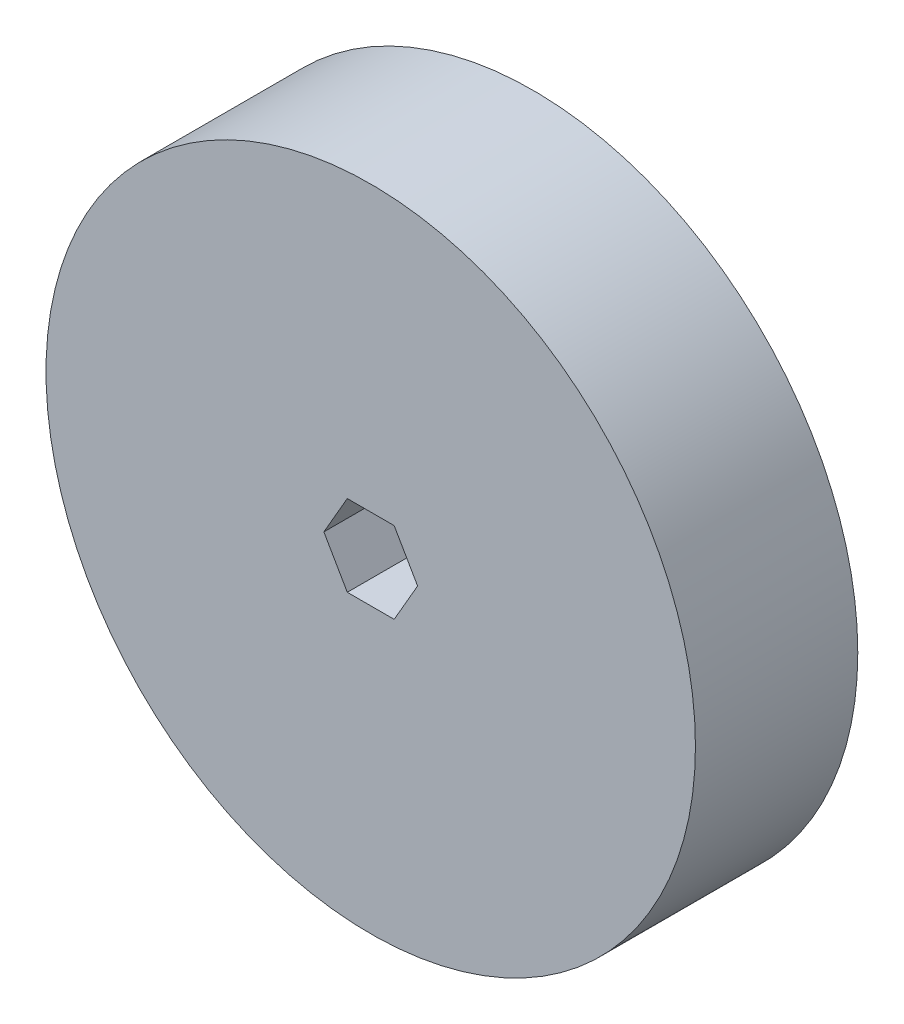
ISO-10303-21;
HEADER;
FILE_DESCRIPTION(('STEP AP214'),'2;1');
FILE_NAME('part.step','',(''),(''),'','','');
FILE_SCHEMA(('AUTOMOTIVE_DESIGN { 1 0 10303 214 1 1 1 1 }'));
ENDSEC;
DATA;
#1=APPLICATION_CONTEXT('core data for automotive mechanical design processes');
#2=APPLICATION_PROTOCOL_DEFINITION('international standard','automotive_design',2000,#1);
#3=PRODUCT_CONTEXT('',#1,'mechanical');
#4=PRODUCT('Part','Part','',(#3));
#5=PRODUCT_RELATED_PRODUCT_CATEGORY('part','',(#4));
#6=PRODUCT_DEFINITION_FORMATION('','',#4);
#7=PRODUCT_DEFINITION_CONTEXT('part definition',#1,'design');
#8=PRODUCT_DEFINITION('design','',#6,#7);
#9=PRODUCT_DEFINITION_SHAPE('','',#8);
#10=(LENGTH_UNIT() NAMED_UNIT(*) SI_UNIT(.MILLI.,.METRE.));
#11=(NAMED_UNIT(*) PLANE_ANGLE_UNIT() SI_UNIT($,.RADIAN.));
#12=(NAMED_UNIT(*) SI_UNIT($,.STERADIAN.) SOLID_ANGLE_UNIT());
#13=UNCERTAINTY_MEASURE_WITH_UNIT(LENGTH_MEASURE(1.E-05),#10,'distance_accuracy_value','');
#14=(GEOMETRIC_REPRESENTATION_CONTEXT(3) GLOBAL_UNCERTAINTY_ASSIGNED_CONTEXT((#13)) GLOBAL_UNIT_ASSIGNED_CONTEXT((#10,
#11,#12)) REPRESENTATION_CONTEXT('',''));
#15=CARTESIAN_POINT('',(0.,0.,0.));
#16=DIRECTION('',(0.,0.,1.));
#17=DIRECTION('',(1.,0.,0.));
#18=AXIS2_PLACEMENT_3D('',#15,#16,#17);
#19=CARTESIAN_POINT('',(0.,0.,25.4));
#20=DIRECTION('',(0.,0.,1.));
#21=DIRECTION('',(1.,0.,0.));
#22=AXIS2_PLACEMENT_3D('',#19,#20,#21);
#23=PLANE('',#22);
#24=CARTESIAN_POINT('',(0.,0.,25.4));
#25=DIRECTION('',(0.,0.,1.));
#26=DIRECTION('',(1.,0.,0.));
#27=AXIS2_PLACEMENT_3D('',#24,#25,#26);
#28=CIRCLE('',#27,50.8);
#29=CARTESIAN_POINT('',(50.8,0.,25.4));
#30=VERTEX_POINT('',#29);
#31=EDGE_CURVE('E11',#30,#30,#28,.T.);
#32=ORIENTED_EDGE('',*,*,#31,.T.);
#33=EDGE_LOOP('',(#32));
#34=FACE_BOUND('',#33,.T.);
#35=DIRECTION('',(-0.500000000000001,0.866025403784438,0.));
#36=VECTOR('',#35,1.);
#37=CARTESIAN_POINT('',(7.33234841870822,0.,25.4));
#38=LINE('',#37,#36);
#39=CARTESIAN_POINT('',(7.33234841870822,0.,25.4));
#40=VERTEX_POINT('',#39);
#41=CARTESIAN_POINT('',(3.6661742093541,6.34999999999999,25.4));
#42=VERTEX_POINT('',#41);
#43=EDGE_CURVE('E96',#40,#42,#38,.T.);
#44=ORIENTED_EDGE('',*,*,#43,.F.);
#45=DIRECTION('',(0.499999999999995,0.866025403784442,0.));
#46=VECTOR('',#45,1.);
#47=CARTESIAN_POINT('',(3.66617420935419,-6.34999999999994,25.4));
#48=LINE('',#47,#46);
#49=CARTESIAN_POINT('',(3.66617420935419,-6.34999999999994,25.4));
#50=VERTEX_POINT('',#49);
#51=EDGE_CURVE('E88',#50,#40,#48,.T.);
#52=ORIENTED_EDGE('',*,*,#51,.F.);
#53=DIRECTION('',(1.,0.,0.));
#54=VECTOR('',#53,1.);
#55=CARTESIAN_POINT('',(-3.66617420935405,-6.35000000000001,25.4));
#56=LINE('',#55,#54);
#57=CARTESIAN_POINT('',(-3.66617420935405,-6.35000000000001,25.4));
#58=VERTEX_POINT('',#57);
#59=EDGE_CURVE('E116',#58,#50,#56,.T.);
#60=ORIENTED_EDGE('',*,*,#59,.F.);
#61=DIRECTION('',(0.500000000000007,-0.866025403784435,0.));
#62=VECTOR('',#61,1.);
#63=CARTESIAN_POINT('',(-7.33234841870822,0.,25.4));
#64=LINE('',#63,#62);
#65=CARTESIAN_POINT('',(-7.33234841870822,0.,25.4));
#66=VERTEX_POINT('',#65);
#67=EDGE_CURVE('E114',#66,#58,#64,.T.);
#68=ORIENTED_EDGE('',*,*,#67,.F.);
#69=DIRECTION('',(-0.499999999999995,-0.866025403784442,0.));
#70=VECTOR('',#69,1.);
#71=CARTESIAN_POINT('',(-3.66617420935414,6.34999999999996,25.4));
#72=LINE('',#71,#70);
#73=CARTESIAN_POINT('',(-3.66617420935414,6.34999999999996,25.4));
#74=VERTEX_POINT('',#73);
#75=EDGE_CURVE('E110',#74,#66,#72,.T.);
#76=ORIENTED_EDGE('',*,*,#75,.F.);
#77=DIRECTION('',(-1.,0.,0.));
#78=VECTOR('',#77,1.);
#79=CARTESIAN_POINT('',(3.6661742093541,6.34999999999999,25.4));
#80=LINE('',#79,#78);
#81=EDGE_CURVE('E108',#42,#74,#80,.T.);
#82=ORIENTED_EDGE('',*,*,#81,.F.);
#83=EDGE_LOOP('',(#44,#52,#60,#68,#76,#82));
#84=FACE_BOUND('',#83,.T.);
#85=ADVANCED_FACE('F35',(#34,#84),#23,.T.);
#86=CARTESIAN_POINT('',(0.,0.,0.));
#87=DIRECTION('',(0.,0.,1.));
#88=DIRECTION('',(1.,0.,0.));
#89=AXIS2_PLACEMENT_3D('',#86,#87,#88);
#90=PLANE('',#89);
#91=CARTESIAN_POINT('',(0.,0.,0.));
#92=DIRECTION('',(0.,0.,1.));
#93=DIRECTION('',(1.,0.,0.));
#94=AXIS2_PLACEMENT_3D('',#91,#92,#93);
#95=CIRCLE('',#94,50.8);
#96=CARTESIAN_POINT('',(50.8,0.,0.));
#97=VERTEX_POINT('',#96);
#98=EDGE_CURVE('E39',#97,#97,#95,.T.);
#99=ORIENTED_EDGE('',*,*,#98,.F.);
#100=EDGE_LOOP('',(#99));
#101=FACE_BOUND('',#100,.T.);
#102=DIRECTION('',(0.499999999999995,0.866025403784442,0.));
#103=VECTOR('',#102,1.);
#104=CARTESIAN_POINT('',(3.66617420935419,-6.34999999999994,0.));
#105=LINE('',#104,#103);
#106=CARTESIAN_POINT('',(3.66617420935419,-6.34999999999994,0.));
#107=VERTEX_POINT('',#106);
#108=CARTESIAN_POINT('',(7.33234841870822,0.,0.));
#109=VERTEX_POINT('',#108);
#110=EDGE_CURVE('E58',#107,#109,#105,.T.);
#111=ORIENTED_EDGE('',*,*,#110,.T.);
#112=DIRECTION('',(-0.500000000000001,0.866025403784438,0.));
#113=VECTOR('',#112,1.);
#114=CARTESIAN_POINT('',(7.33234841870822,0.,0.));
#115=LINE('',#114,#113);
#116=CARTESIAN_POINT('',(3.6661742093541,6.34999999999999,0.));
#117=VERTEX_POINT('',#116);
#118=EDGE_CURVE('E103',#109,#117,#115,.T.);
#119=ORIENTED_EDGE('',*,*,#118,.T.);
#120=DIRECTION('',(-1.,0.,0.));
#121=VECTOR('',#120,1.);
#122=CARTESIAN_POINT('',(3.6661742093541,6.34999999999999,0.));
#123=LINE('',#122,#121);
#124=CARTESIAN_POINT('',(-3.66617420935414,6.34999999999996,0.));
#125=VERTEX_POINT('',#124);
#126=EDGE_CURVE('E120',#117,#125,#123,.T.);
#127=ORIENTED_EDGE('',*,*,#126,.T.);
#128=DIRECTION('',(-0.499999999999995,-0.866025403784442,0.));
#129=VECTOR('',#128,1.);
#130=CARTESIAN_POINT('',(-3.66617420935414,6.34999999999996,0.));
#131=LINE('',#130,#129);
#132=CARTESIAN_POINT('',(-7.33234841870822,0.,0.));
#133=VERTEX_POINT('',#132);
#134=EDGE_CURVE('E123',#125,#133,#131,.T.);
#135=ORIENTED_EDGE('',*,*,#134,.T.);
#136=DIRECTION('',(0.500000000000007,-0.866025403784435,0.));
#137=VECTOR('',#136,1.);
#138=CARTESIAN_POINT('',(-7.33234841870822,0.,0.));
#139=LINE('',#138,#137);
#140=CARTESIAN_POINT('',(-3.66617420935405,-6.35000000000001,0.));
#141=VERTEX_POINT('',#140);
#142=EDGE_CURVE('E126',#133,#141,#139,.T.);
#143=ORIENTED_EDGE('',*,*,#142,.T.);
#144=DIRECTION('',(1.,0.,0.));
#145=VECTOR('',#144,1.);
#146=CARTESIAN_POINT('',(-3.66617420935405,-6.35000000000001,0.));
#147=LINE('',#146,#145);
#148=EDGE_CURVE('E97',#141,#107,#147,.T.);
#149=ORIENTED_EDGE('',*,*,#148,.T.);
#150=EDGE_LOOP('',(#111,#119,#127,#135,#143,#149));
#151=FACE_BOUND('',#150,.T.);
#152=ADVANCED_FACE('F143',(#101,#151),#90,.F.);
#153=CARTESIAN_POINT('',(0.,0.,25.4));
#154=DIRECTION('',(0.,0.,-1.));
#155=DIRECTION('',(-1.,0.,0.));
#156=AXIS2_PLACEMENT_3D('',#153,#154,#155);
#157=CYLINDRICAL_SURFACE('',#156,50.8);
#158=ORIENTED_EDGE('',*,*,#31,.F.);
#159=EDGE_LOOP('',(#158));
#160=FACE_BOUND('',#159,.T.);
#161=ORIENTED_EDGE('',*,*,#98,.T.);
#162=EDGE_LOOP('',(#161));
#163=FACE_BOUND('',#162,.T.);
#164=ADVANCED_FACE('F37',(#160,#163),#157,.T.);
#165=CARTESIAN_POINT('',(3.66617420935419,-6.34999999999994,25.4));
#166=DIRECTION('',(-0.866025403784442,0.499999999999995,0.));
#167=DIRECTION('',(-0.499999999999995,-0.866025403784442,0.));
#168=AXIS2_PLACEMENT_3D('',#165,#166,#167);
#169=PLANE('',#168);
#170=ORIENTED_EDGE('',*,*,#110,.F.);
#171=DIRECTION('',(0.,0.,-1.));
#172=VECTOR('',#171,1.);
#173=CARTESIAN_POINT('',(3.66617420935419,-6.34999999999994,25.4));
#174=LINE('',#173,#172);
#175=EDGE_CURVE('E92',#50,#107,#174,.T.);
#176=ORIENTED_EDGE('',*,*,#175,.F.);
#177=ORIENTED_EDGE('',*,*,#51,.T.);
#178=DIRECTION('',(0.,0.,-1.));
#179=VECTOR('',#178,1.);
#180=CARTESIAN_POINT('',(7.33234841870822,0.,25.4));
#181=LINE('',#180,#179);
#182=EDGE_CURVE('E91',#40,#109,#181,.T.);
#183=ORIENTED_EDGE('',*,*,#182,.T.);
#184=EDGE_LOOP('',(#170,#176,#177,#183));
#185=FACE_BOUND('',#184,.T.);
#186=ADVANCED_FACE('F90',(#185),#169,.T.);
#187=CARTESIAN_POINT('',(7.33234841870822,0.,25.4));
#188=DIRECTION('',(-0.866025403784438,-0.500000000000001,0.));
#189=DIRECTION('',(0.500000000000001,-0.866025403784438,0.));
#190=AXIS2_PLACEMENT_3D('',#187,#188,#189);
#191=PLANE('',#190);
#192=ORIENTED_EDGE('',*,*,#118,.F.);
#193=ORIENTED_EDGE('',*,*,#182,.F.);
#194=ORIENTED_EDGE('',*,*,#43,.T.);
#195=DIRECTION('',(0.,0.,-1.));
#196=VECTOR('',#195,1.);
#197=CARTESIAN_POINT('',(3.6661742093541,6.34999999999999,25.4));
#198=LINE('',#197,#196);
#199=EDGE_CURVE('E104',#42,#117,#198,.T.);
#200=ORIENTED_EDGE('',*,*,#199,.T.);
#201=EDGE_LOOP('',(#192,#193,#194,#200));
#202=FACE_BOUND('',#201,.T.);
#203=ADVANCED_FACE('F100',(#202),#191,.T.);
#204=CARTESIAN_POINT('',(3.6661742093541,6.34999999999999,25.4));
#205=DIRECTION('',(0.,-1.,0.));
#206=DIRECTION('',(1.,0.,0.));
#207=AXIS2_PLACEMENT_3D('',#204,#205,#206);
#208=PLANE('',#207);
#209=ORIENTED_EDGE('',*,*,#126,.F.);
#210=ORIENTED_EDGE('',*,*,#199,.F.);
#211=ORIENTED_EDGE('',*,*,#81,.T.);
#212=DIRECTION('',(0.,0.,-1.));
#213=VECTOR('',#212,1.);
#214=CARTESIAN_POINT('',(-3.66617420935414,6.34999999999996,25.4));
#215=LINE('',#214,#213);
#216=EDGE_CURVE('E135',#74,#125,#215,.T.);
#217=ORIENTED_EDGE('',*,*,#216,.T.);
#218=EDGE_LOOP('',(#209,#210,#211,#217));
#219=FACE_BOUND('',#218,.T.);
#220=ADVANCED_FACE('F139',(#219),#208,.T.);
#221=CARTESIAN_POINT('',(-3.66617420935414,6.34999999999996,25.4));
#222=DIRECTION('',(0.866025403784441,-0.499999999999995,0.));
#223=DIRECTION('',(0.499999999999995,0.866025403784442,0.));
#224=AXIS2_PLACEMENT_3D('',#221,#222,#223);
#225=PLANE('',#224);
#226=ORIENTED_EDGE('',*,*,#134,.F.);
#227=ORIENTED_EDGE('',*,*,#216,.F.);
#228=ORIENTED_EDGE('',*,*,#75,.T.);
#229=DIRECTION('',(0.,0.,-1.));
#230=VECTOR('',#229,1.);
#231=CARTESIAN_POINT('',(-7.33234841870822,0.,25.4));
#232=LINE('',#231,#230);
#233=EDGE_CURVE('E133',#66,#133,#232,.T.);
#234=ORIENTED_EDGE('',*,*,#233,.T.);
#235=EDGE_LOOP('',(#226,#227,#228,#234));
#236=FACE_BOUND('',#235,.T.);
#237=ADVANCED_FACE('F151',(#236),#225,.T.);
#238=CARTESIAN_POINT('',(-7.33234841870822,0.,25.4));
#239=DIRECTION('',(0.866025403784434,0.500000000000007,0.));
#240=DIRECTION('',(-0.500000000000007,0.866025403784435,0.));
#241=AXIS2_PLACEMENT_3D('',#238,#239,#240);
#242=PLANE('',#241);
#243=ORIENTED_EDGE('',*,*,#142,.F.);
#244=ORIENTED_EDGE('',*,*,#233,.F.);
#245=ORIENTED_EDGE('',*,*,#67,.T.);
#246=DIRECTION('',(0.,0.,-1.));
#247=VECTOR('',#246,1.);
#248=CARTESIAN_POINT('',(-3.66617420935405,-6.35000000000001,25.4));
#249=LINE('',#248,#247);
#250=EDGE_CURVE('E50',#58,#141,#249,.T.);
#251=ORIENTED_EDGE('',*,*,#250,.T.);
#252=EDGE_LOOP('',(#243,#244,#245,#251));
#253=FACE_BOUND('',#252,.T.);
#254=ADVANCED_FACE('F149',(#253),#242,.T.);
#255=CARTESIAN_POINT('',(-3.66617420935405,-6.35000000000001,25.4));
#256=DIRECTION('',(0.,1.,0.));
#257=DIRECTION('',(-1.,0.,0.));
#258=AXIS2_PLACEMENT_3D('',#255,#256,#257);
#259=PLANE('',#258);
#260=ORIENTED_EDGE('',*,*,#148,.F.);
#261=ORIENTED_EDGE('',*,*,#250,.F.);
#262=ORIENTED_EDGE('',*,*,#59,.T.);
#263=ORIENTED_EDGE('',*,*,#175,.T.);
#264=EDGE_LOOP('',(#260,#261,#262,#263));
#265=FACE_BOUND('',#264,.T.);
#266=ADVANCED_FACE('F145',(#265),#259,.T.);
#267=CLOSED_SHELL('',(#85,#152,#164,#186,#203,#220,#237,#254,#266));
#268=MANIFOLD_SOLID_BREP('B2',#267);
#269=ADVANCED_BREP_SHAPE_REPRESENTATION('',(#18,#268),#14);
#270=SHAPE_DEFINITION_REPRESENTATION(#9,#269);
ENDSEC;
END-ISO-10303-21;
